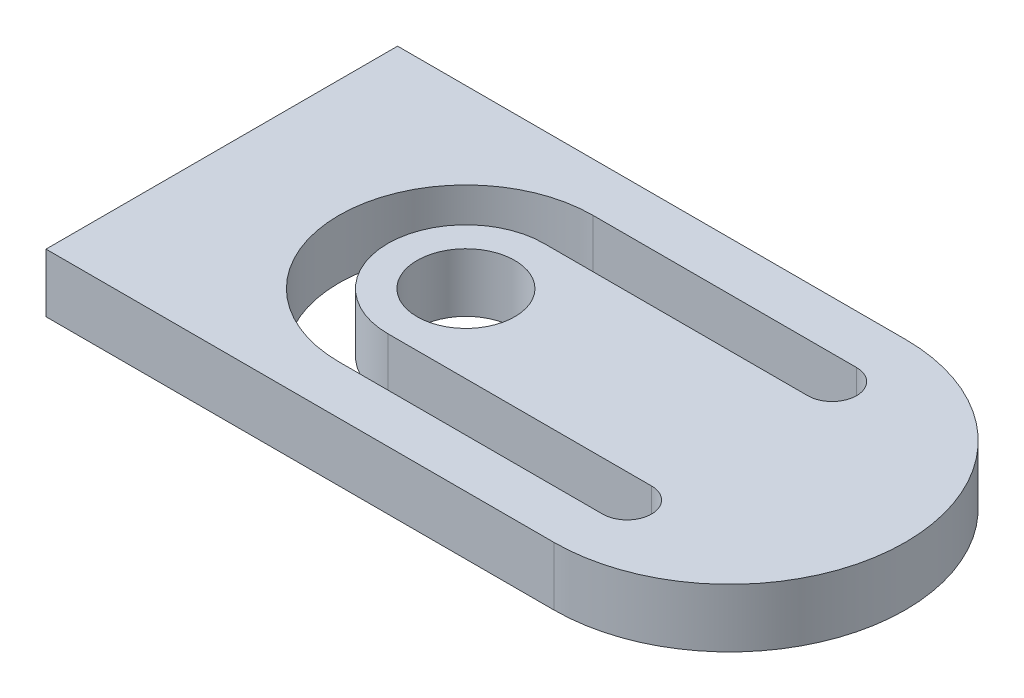
ISO-10303-21;
HEADER;
FILE_DESCRIPTION(('STEP AP214'),'2;1');
FILE_NAME('part.step','',(''),(''),'','','');
FILE_SCHEMA(('AUTOMOTIVE_DESIGN { 1 0 10303 214 1 1 1 1 }'));
ENDSEC;
DATA;
#1=APPLICATION_CONTEXT('core data for automotive mechanical design processes');
#2=APPLICATION_PROTOCOL_DEFINITION('international standard','automotive_design',2000,#1);
#3=PRODUCT_CONTEXT('',#1,'mechanical');
#4=PRODUCT('Part','Part','',(#3));
#5=PRODUCT_RELATED_PRODUCT_CATEGORY('part','',(#4));
#6=PRODUCT_DEFINITION_FORMATION('','',#4);
#7=PRODUCT_DEFINITION_CONTEXT('part definition',#1,'design');
#8=PRODUCT_DEFINITION('design','',#6,#7);
#9=PRODUCT_DEFINITION_SHAPE('','',#8);
#10=(LENGTH_UNIT() NAMED_UNIT(*) SI_UNIT(.MILLI.,.METRE.));
#11=(NAMED_UNIT(*) PLANE_ANGLE_UNIT() SI_UNIT($,.RADIAN.));
#12=(NAMED_UNIT(*) SI_UNIT($,.STERADIAN.) SOLID_ANGLE_UNIT());
#13=UNCERTAINTY_MEASURE_WITH_UNIT(LENGTH_MEASURE(1.E-05),#10,'distance_accuracy_value','');
#14=(GEOMETRIC_REPRESENTATION_CONTEXT(3) GLOBAL_UNCERTAINTY_ASSIGNED_CONTEXT((#13)) GLOBAL_UNIT_ASSIGNED_CONTEXT((#10,
#11,#12)) REPRESENTATION_CONTEXT('',''));
#15=CARTESIAN_POINT('',(0.,0.,0.));
#16=DIRECTION('',(0.,0.,1.));
#17=DIRECTION('',(1.,0.,0.));
#18=AXIS2_PLACEMENT_3D('',#15,#16,#17);
#19=CARTESIAN_POINT('',(6.64397905759164,3.,0.));
#20=DIRECTION('',(0.,-1.,0.));
#21=DIRECTION('',(0.,0.,-1.));
#22=AXIS2_PLACEMENT_3D('',#19,#20,#21);
#23=PLANE('',#22);
#24=CARTESIAN_POINT('',(-6.85602094240837,3.,0.));
#25=DIRECTION('',(0.,1.,0.));
#26=DIRECTION('',(0.,0.,1.));
#27=AXIS2_PLACEMENT_3D('',#24,#25,#26);
#28=CIRCLE('',#27,2.5);
#29=CARTESIAN_POINT('',(-6.85602094240837,3.,2.5));
#30=VERTEX_POINT('',#29);
#31=EDGE_CURVE('E187',#30,#30,#28,.T.);
#32=ORIENTED_EDGE('',*,*,#31,.F.);
#33=EDGE_LOOP('',(#32));
#34=FACE_BOUND('',#33,.T.);
#35=DIRECTION('',(0.,0.,1.));
#36=VECTOR('',#35,1.);
#37=CARTESIAN_POINT('',(-19.3560209424084,3.,-9.));
#38=LINE('',#37,#36);
#39=CARTESIAN_POINT('',(-19.3560209424084,3.,-9.));
#40=VERTEX_POINT('',#39);
#41=CARTESIAN_POINT('',(-19.3560209424084,3.,9.));
#42=VERTEX_POINT('',#41);
#43=EDGE_CURVE('E193',#40,#42,#38,.T.);
#44=ORIENTED_EDGE('',*,*,#43,.T.);
#45=DIRECTION('',(1.,0.,0.));
#46=VECTOR('',#45,1.);
#47=CARTESIAN_POINT('',(-19.3560209424084,3.,9.));
#48=LINE('',#47,#46);
#49=CARTESIAN_POINT('',(6.64397905759164,3.,9.00000000000001));
#50=VERTEX_POINT('',#49);
#51=EDGE_CURVE('E196',#42,#50,#48,.T.);
#52=ORIENTED_EDGE('',*,*,#51,.T.);
#53=CARTESIAN_POINT('',(6.64397905759164,3.,0.));
#54=DIRECTION('',(0.,1.,0.));
#55=DIRECTION('',(0.,0.,-1.));
#56=AXIS2_PLACEMENT_3D('',#53,#54,#55);
#57=CIRCLE('',#56,9.);
#58=CARTESIAN_POINT('',(6.64397905759163,3.,-9.));
#59=VERTEX_POINT('',#58);
#60=EDGE_CURVE('E199',#50,#59,#57,.T.);
#61=ORIENTED_EDGE('',*,*,#60,.T.);
#62=DIRECTION('',(-1.,0.,0.));
#63=VECTOR('',#62,1.);
#64=CARTESIAN_POINT('',(-19.3560209424084,3.,-9.));
#65=LINE('',#64,#63);
#66=EDGE_CURVE('E201',#59,#40,#65,.T.);
#67=ORIENTED_EDGE('',*,*,#66,.T.);
#68=EDGE_LOOP('',(#44,#52,#61,#67));
#69=FACE_BOUND('',#68,.T.);
#70=CARTESIAN_POINT('',(6.64397905759163,3.,-5.25));
#71=DIRECTION('',(0.,1.,0.));
#72=DIRECTION('',(0.,0.,-1.));
#73=AXIS2_PLACEMENT_3D('',#70,#71,#72);
#74=CIRCLE('',#73,1.25);
#75=CARTESIAN_POINT('',(6.64397905759163,3.,-4.));
#76=VERTEX_POINT('',#75);
#77=CARTESIAN_POINT('',(6.64397905759163,3.,-6.5));
#78=VERTEX_POINT('',#77);
#79=EDGE_CURVE('E122',#76,#78,#74,.T.);
#80=ORIENTED_EDGE('',*,*,#79,.F.);
#81=DIRECTION('',(1.,0.,0.));
#82=VECTOR('',#81,1.);
#83=CARTESIAN_POINT('',(-6.85602094240837,3.,-4.));
#84=LINE('',#83,#82);
#85=CARTESIAN_POINT('',(-6.85602094240837,3.,-4.));
#86=VERTEX_POINT('',#85);
#87=EDGE_CURVE('E155',#86,#76,#84,.T.);
#88=ORIENTED_EDGE('',*,*,#87,.F.);
#89=CARTESIAN_POINT('',(-6.85602094240837,3.,0.));
#90=DIRECTION('',(0.,-1.,0.));
#91=DIRECTION('',(0.,0.,1.));
#92=AXIS2_PLACEMENT_3D('',#89,#90,#91);
#93=CIRCLE('',#92,4.);
#94=CARTESIAN_POINT('',(-6.85602094240837,3.,4.));
#95=VERTEX_POINT('',#94);
#96=EDGE_CURVE('E153',#95,#86,#93,.T.);
#97=ORIENTED_EDGE('',*,*,#96,.F.);
#98=DIRECTION('',(-1.,0.,0.));
#99=VECTOR('',#98,1.);
#100=CARTESIAN_POINT('',(-6.85602094240837,3.,4.));
#101=LINE('',#100,#99);
#102=CARTESIAN_POINT('',(6.64397905759164,3.,4.));
#103=VERTEX_POINT('',#102);
#104=EDGE_CURVE('E151',#103,#95,#101,.T.);
#105=ORIENTED_EDGE('',*,*,#104,.F.);
#106=CARTESIAN_POINT('',(6.64397905759164,3.,5.25));
#107=DIRECTION('',(0.,1.,0.));
#108=DIRECTION('',(0.,0.,-1.));
#109=AXIS2_PLACEMENT_3D('',#106,#107,#108);
#110=CIRCLE('',#109,1.25);
#111=CARTESIAN_POINT('',(6.64397905759164,3.,6.5));
#112=VERTEX_POINT('',#111);
#113=EDGE_CURVE('E149',#112,#103,#110,.T.);
#114=ORIENTED_EDGE('',*,*,#113,.F.);
#115=DIRECTION('',(1.,0.,0.));
#116=VECTOR('',#115,1.);
#117=CARTESIAN_POINT('',(-6.85602094240837,3.,6.5));
#118=LINE('',#117,#116);
#119=CARTESIAN_POINT('',(-6.85602094240837,3.,6.5));
#120=VERTEX_POINT('',#119);
#121=EDGE_CURVE('E145',#120,#112,#118,.T.);
#122=ORIENTED_EDGE('',*,*,#121,.F.);
#123=CARTESIAN_POINT('',(-6.85602094240837,3.,0.));
#124=DIRECTION('',(0.,1.,0.));
#125=DIRECTION('',(0.,0.,1.));
#126=AXIS2_PLACEMENT_3D('',#123,#124,#125);
#127=CIRCLE('',#126,6.5);
#128=CARTESIAN_POINT('',(-6.85602094240837,3.,-6.5));
#129=VERTEX_POINT('',#128);
#130=EDGE_CURVE('E143',#129,#120,#127,.T.);
#131=ORIENTED_EDGE('',*,*,#130,.F.);
#132=DIRECTION('',(-1.,0.,0.));
#133=VECTOR('',#132,1.);
#134=CARTESIAN_POINT('',(-6.85602094240837,3.,-6.5));
#135=LINE('',#134,#133);
#136=EDGE_CURVE('E130',#78,#129,#135,.T.);
#137=ORIENTED_EDGE('',*,*,#136,.F.);
#138=EDGE_LOOP('',(#80,#88,#97,#105,#114,#122,#131,#137));
#139=FACE_BOUND('',#138,.T.);
#140=ADVANCED_FACE('F33',(#34,#69,#139),#23,.F.);
#141=CARTESIAN_POINT('',(6.64397905759164,0.,0.));
#142=DIRECTION('',(0.,-1.,0.));
#143=DIRECTION('',(0.,0.,-1.));
#144=AXIS2_PLACEMENT_3D('',#141,#142,#143);
#145=PLANE('',#144);
#146=DIRECTION('',(0.,0.,1.));
#147=VECTOR('',#146,1.);
#148=CARTESIAN_POINT('',(-19.3560209424084,0.,-9.));
#149=LINE('',#148,#147);
#150=CARTESIAN_POINT('',(-19.3560209424084,0.,-9.));
#151=VERTEX_POINT('',#150);
#152=CARTESIAN_POINT('',(-19.3560209424084,0.,9.));
#153=VERTEX_POINT('',#152);
#154=EDGE_CURVE('E190',#151,#153,#149,.T.);
#155=ORIENTED_EDGE('',*,*,#154,.F.);
#156=DIRECTION('',(-1.,0.,0.));
#157=VECTOR('',#156,1.);
#158=CARTESIAN_POINT('',(-19.3560209424084,0.,-9.));
#159=LINE('',#158,#157);
#160=CARTESIAN_POINT('',(6.64397905759163,0.,-9.));
#161=VERTEX_POINT('',#160);
#162=EDGE_CURVE('E197',#161,#151,#159,.T.);
#163=ORIENTED_EDGE('',*,*,#162,.F.);
#164=CARTESIAN_POINT('',(6.64397905759164,0.,0.));
#165=DIRECTION('',(0.,1.,0.));
#166=DIRECTION('',(0.,0.,-1.));
#167=AXIS2_PLACEMENT_3D('',#164,#165,#166);
#168=CIRCLE('',#167,9.);
#169=CARTESIAN_POINT('',(6.64397905759164,0.,9.00000000000001));
#170=VERTEX_POINT('',#169);
#171=EDGE_CURVE('E208',#170,#161,#168,.T.);
#172=ORIENTED_EDGE('',*,*,#171,.F.);
#173=DIRECTION('',(1.,0.,0.));
#174=VECTOR('',#173,1.);
#175=CARTESIAN_POINT('',(-19.3560209424084,0.,9.));
#176=LINE('',#175,#174);
#177=EDGE_CURVE('E206',#153,#170,#176,.T.);
#178=ORIENTED_EDGE('',*,*,#177,.F.);
#179=EDGE_LOOP('',(#155,#163,#172,#178));
#180=FACE_BOUND('',#179,.T.);
#181=CARTESIAN_POINT('',(-6.85602094240837,0.,0.));
#182=DIRECTION('',(0.,1.,0.));
#183=DIRECTION('',(0.,0.,1.));
#184=AXIS2_PLACEMENT_3D('',#181,#182,#183);
#185=CIRCLE('',#184,2.5);
#186=CARTESIAN_POINT('',(-6.85602094240837,0.,2.5));
#187=VERTEX_POINT('',#186);
#188=EDGE_CURVE('E138',#187,#187,#185,.T.);
#189=ORIENTED_EDGE('',*,*,#188,.T.);
#190=EDGE_LOOP('',(#189));
#191=FACE_BOUND('',#190,.T.);
#192=DIRECTION('',(1.,0.,0.));
#193=VECTOR('',#192,1.);
#194=CARTESIAN_POINT('',(-6.85602094240837,0.,-4.));
#195=LINE('',#194,#193);
#196=CARTESIAN_POINT('',(-6.85602094240837,0.,-4.));
#197=VERTEX_POINT('',#196);
#198=CARTESIAN_POINT('',(6.64397905759163,0.,-4.));
#199=VERTEX_POINT('',#198);
#200=EDGE_CURVE('E131',#197,#199,#195,.T.);
#201=ORIENTED_EDGE('',*,*,#200,.T.);
#202=CARTESIAN_POINT('',(6.64397905759163,0.,-5.25));
#203=DIRECTION('',(0.,1.,0.));
#204=DIRECTION('',(0.,0.,-1.));
#205=AXIS2_PLACEMENT_3D('',#202,#203,#204);
#206=CIRCLE('',#205,1.25);
#207=CARTESIAN_POINT('',(6.64397905759163,0.,-6.5));
#208=VERTEX_POINT('',#207);
#209=EDGE_CURVE('E56',#199,#208,#206,.T.);
#210=ORIENTED_EDGE('',*,*,#209,.T.);
#211=DIRECTION('',(-1.,0.,0.));
#212=VECTOR('',#211,1.);
#213=CARTESIAN_POINT('',(-6.85602094240837,0.,-6.5));
#214=LINE('',#213,#212);
#215=CARTESIAN_POINT('',(-6.85602094240837,0.,-6.5));
#216=VERTEX_POINT('',#215);
#217=EDGE_CURVE('E137',#208,#216,#214,.T.);
#218=ORIENTED_EDGE('',*,*,#217,.T.);
#219=CARTESIAN_POINT('',(-6.85602094240837,0.,0.));
#220=DIRECTION('',(0.,1.,0.));
#221=DIRECTION('',(0.,0.,1.));
#222=AXIS2_PLACEMENT_3D('',#219,#220,#221);
#223=CIRCLE('',#222,6.5);
#224=CARTESIAN_POINT('',(-6.85602094240837,0.,6.5));
#225=VERTEX_POINT('',#224);
#226=EDGE_CURVE('E159',#216,#225,#223,.T.);
#227=ORIENTED_EDGE('',*,*,#226,.T.);
#228=DIRECTION('',(1.,0.,0.));
#229=VECTOR('',#228,1.);
#230=CARTESIAN_POINT('',(-6.85602094240837,0.,6.5));
#231=LINE('',#230,#229);
#232=CARTESIAN_POINT('',(6.64397905759164,0.,6.5));
#233=VERTEX_POINT('',#232);
#234=EDGE_CURVE('E162',#225,#233,#231,.T.);
#235=ORIENTED_EDGE('',*,*,#234,.T.);
#236=CARTESIAN_POINT('',(6.64397905759164,0.,5.25));
#237=DIRECTION('',(0.,1.,0.));
#238=DIRECTION('',(0.,0.,-1.));
#239=AXIS2_PLACEMENT_3D('',#236,#237,#238);
#240=CIRCLE('',#239,1.25);
#241=CARTESIAN_POINT('',(6.64397905759164,0.,4.));
#242=VERTEX_POINT('',#241);
#243=EDGE_CURVE('E165',#233,#242,#240,.T.);
#244=ORIENTED_EDGE('',*,*,#243,.T.);
#245=DIRECTION('',(-1.,0.,0.));
#246=VECTOR('',#245,1.);
#247=CARTESIAN_POINT('',(-6.85602094240837,0.,4.));
#248=LINE('',#247,#246);
#249=CARTESIAN_POINT('',(-6.85602094240837,0.,4.));
#250=VERTEX_POINT('',#249);
#251=EDGE_CURVE('E168',#242,#250,#248,.T.);
#252=ORIENTED_EDGE('',*,*,#251,.T.);
#253=CARTESIAN_POINT('',(-6.85602094240837,0.,0.));
#254=DIRECTION('',(0.,-1.,0.));
#255=DIRECTION('',(0.,0.,1.));
#256=AXIS2_PLACEMENT_3D('',#253,#254,#255);
#257=CIRCLE('',#256,4.);
#258=EDGE_CURVE('E171',#250,#197,#257,.T.);
#259=ORIENTED_EDGE('',*,*,#258,.T.);
#260=EDGE_LOOP('',(#201,#210,#218,#227,#235,#244,#252,#259));
#261=FACE_BOUND('',#260,.T.);
#262=ADVANCED_FACE('F226',(#180,#191,#261),#145,.T.);
#263=CARTESIAN_POINT('',(-19.3560209424084,3.,-9.));
#264=DIRECTION('',(1.,0.,0.));
#265=DIRECTION('',(0.,0.,-1.));
#266=AXIS2_PLACEMENT_3D('',#263,#264,#265);
#267=PLANE('',#266);
#268=ORIENTED_EDGE('',*,*,#154,.T.);
#269=DIRECTION('',(0.,-1.,0.));
#270=VECTOR('',#269,1.);
#271=CARTESIAN_POINT('',(-19.3560209424084,3.,9.));
#272=LINE('',#271,#270);
#273=EDGE_CURVE('E11',#42,#153,#272,.T.);
#274=ORIENTED_EDGE('',*,*,#273,.F.);
#275=ORIENTED_EDGE('',*,*,#43,.F.);
#276=DIRECTION('',(0.,-1.,0.));
#277=VECTOR('',#276,1.);
#278=CARTESIAN_POINT('',(-19.3560209424084,3.,-9.));
#279=LINE('',#278,#277);
#280=EDGE_CURVE('E203',#40,#151,#279,.T.);
#281=ORIENTED_EDGE('',*,*,#280,.T.);
#282=EDGE_LOOP('',(#268,#274,#275,#281));
#283=FACE_BOUND('',#282,.T.);
#284=ADVANCED_FACE('F35',(#283),#267,.F.);
#285=CARTESIAN_POINT('',(-19.3560209424084,3.,9.));
#286=DIRECTION('',(0.,0.,-1.));
#287=DIRECTION('',(-1.,0.,0.));
#288=AXIS2_PLACEMENT_3D('',#285,#286,#287);
#289=PLANE('',#288);
#290=ORIENTED_EDGE('',*,*,#177,.T.);
#291=DIRECTION('',(0.,-1.,0.));
#292=VECTOR('',#291,1.);
#293=CARTESIAN_POINT('',(6.64397905759164,3.,9.00000000000001));
#294=LINE('',#293,#292);
#295=EDGE_CURVE('E41',#50,#170,#294,.T.);
#296=ORIENTED_EDGE('',*,*,#295,.F.);
#297=ORIENTED_EDGE('',*,*,#51,.F.);
#298=ORIENTED_EDGE('',*,*,#273,.T.);
#299=EDGE_LOOP('',(#290,#296,#297,#298));
#300=FACE_BOUND('',#299,.T.);
#301=ADVANCED_FACE('F236',(#300),#289,.F.);
#302=CARTESIAN_POINT('',(6.64397905759164,3.,0.));
#303=DIRECTION('',(0.,-1.,0.));
#304=DIRECTION('',(0.,0.,-1.));
#305=AXIS2_PLACEMENT_3D('',#302,#303,#304);
#306=CYLINDRICAL_SURFACE('',#305,9.);
#307=ORIENTED_EDGE('',*,*,#171,.T.);
#308=DIRECTION('',(0.,-1.,0.));
#309=VECTOR('',#308,1.);
#310=CARTESIAN_POINT('',(6.64397905759163,3.,-9.));
#311=LINE('',#310,#309);
#312=EDGE_CURVE('E213',#59,#161,#311,.T.);
#313=ORIENTED_EDGE('',*,*,#312,.F.);
#314=ORIENTED_EDGE('',*,*,#60,.F.);
#315=ORIENTED_EDGE('',*,*,#295,.T.);
#316=EDGE_LOOP('',(#307,#313,#314,#315));
#317=FACE_BOUND('',#316,.T.);
#318=ADVANCED_FACE('F220',(#317),#306,.T.);
#319=CARTESIAN_POINT('',(-19.3560209424084,3.,-9.));
#320=DIRECTION('',(0.,0.,1.));
#321=DIRECTION('',(1.,0.,0.));
#322=AXIS2_PLACEMENT_3D('',#319,#320,#321);
#323=PLANE('',#322);
#324=ORIENTED_EDGE('',*,*,#162,.T.);
#325=ORIENTED_EDGE('',*,*,#280,.F.);
#326=ORIENTED_EDGE('',*,*,#66,.F.);
#327=ORIENTED_EDGE('',*,*,#312,.T.);
#328=EDGE_LOOP('',(#324,#325,#326,#327));
#329=FACE_BOUND('',#328,.T.);
#330=ADVANCED_FACE('F230',(#329),#323,.F.);
#331=CARTESIAN_POINT('',(-6.85602094240837,3.,0.));
#332=DIRECTION('',(0.,-1.,0.));
#333=DIRECTION('',(0.,0.,-1.));
#334=AXIS2_PLACEMENT_3D('',#331,#332,#333);
#335=CYLINDRICAL_SURFACE('',#334,2.5);
#336=ORIENTED_EDGE('',*,*,#31,.T.);
#337=EDGE_LOOP('',(#336));
#338=FACE_BOUND('',#337,.T.);
#339=ORIENTED_EDGE('',*,*,#188,.F.);
#340=EDGE_LOOP('',(#339));
#341=FACE_BOUND('',#340,.T.);
#342=ADVANCED_FACE('F252',(#338,#341),#335,.F.);
#343=CARTESIAN_POINT('',(6.64397905759163,3.,-5.25));
#344=DIRECTION('',(0.,-1.,0.));
#345=DIRECTION('',(0.,0.,-1.));
#346=AXIS2_PLACEMENT_3D('',#343,#344,#345);
#347=CYLINDRICAL_SURFACE('',#346,1.25);
#348=ORIENTED_EDGE('',*,*,#209,.F.);
#349=DIRECTION('',(0.,-1.,0.));
#350=VECTOR('',#349,1.);
#351=CARTESIAN_POINT('',(6.64397905759163,3.,-4.));
#352=LINE('',#351,#350);
#353=EDGE_CURVE('E126',#76,#199,#352,.T.);
#354=ORIENTED_EDGE('',*,*,#353,.F.);
#355=ORIENTED_EDGE('',*,*,#79,.T.);
#356=DIRECTION('',(0.,-1.,0.));
#357=VECTOR('',#356,1.);
#358=CARTESIAN_POINT('',(6.64397905759163,3.,-6.5));
#359=LINE('',#358,#357);
#360=EDGE_CURVE('E125',#78,#208,#359,.T.);
#361=ORIENTED_EDGE('',*,*,#360,.T.);
#362=EDGE_LOOP('',(#348,#354,#355,#361));
#363=FACE_BOUND('',#362,.T.);
#364=ADVANCED_FACE('F124',(#363),#347,.F.);
#365=CARTESIAN_POINT('',(-6.85602094240837,3.,-6.5));
#366=DIRECTION('',(0.,0.,1.));
#367=DIRECTION('',(1.,0.,0.));
#368=AXIS2_PLACEMENT_3D('',#365,#366,#367);
#369=PLANE('',#368);
#370=ORIENTED_EDGE('',*,*,#217,.F.);
#371=ORIENTED_EDGE('',*,*,#360,.F.);
#372=ORIENTED_EDGE('',*,*,#136,.T.);
#373=DIRECTION('',(0.,-1.,0.));
#374=VECTOR('',#373,1.);
#375=CARTESIAN_POINT('',(-6.85602094240837,3.,-6.5));
#376=LINE('',#375,#374);
#377=EDGE_CURVE('E139',#129,#216,#376,.T.);
#378=ORIENTED_EDGE('',*,*,#377,.T.);
#379=EDGE_LOOP('',(#370,#371,#372,#378));
#380=FACE_BOUND('',#379,.T.);
#381=ADVANCED_FACE('F134',(#380),#369,.T.);
#382=CARTESIAN_POINT('',(-6.85602094240837,3.,0.));
#383=DIRECTION('',(0.,-1.,0.));
#384=DIRECTION('',(0.,0.,-1.));
#385=AXIS2_PLACEMENT_3D('',#382,#383,#384);
#386=CYLINDRICAL_SURFACE('',#385,6.5);
#387=ORIENTED_EDGE('',*,*,#226,.F.);
#388=ORIENTED_EDGE('',*,*,#377,.F.);
#389=ORIENTED_EDGE('',*,*,#130,.T.);
#390=DIRECTION('',(0.,-1.,0.));
#391=VECTOR('',#390,1.);
#392=CARTESIAN_POINT('',(-6.85602094240837,3.,6.5));
#393=LINE('',#392,#391);
#394=EDGE_CURVE('E184',#120,#225,#393,.T.);
#395=ORIENTED_EDGE('',*,*,#394,.T.);
#396=EDGE_LOOP('',(#387,#388,#389,#395));
#397=FACE_BOUND('',#396,.T.);
#398=ADVANCED_FACE('F288',(#397),#386,.F.);
#399=CARTESIAN_POINT('',(-6.85602094240837,3.,6.5));
#400=DIRECTION('',(0.,0.,-1.));
#401=DIRECTION('',(-1.,0.,0.));
#402=AXIS2_PLACEMENT_3D('',#399,#400,#401);
#403=PLANE('',#402);
#404=ORIENTED_EDGE('',*,*,#234,.F.);
#405=ORIENTED_EDGE('',*,*,#394,.F.);
#406=ORIENTED_EDGE('',*,*,#121,.T.);
#407=DIRECTION('',(0.,-1.,0.));
#408=VECTOR('',#407,1.);
#409=CARTESIAN_POINT('',(6.64397905759164,3.,6.5));
#410=LINE('',#409,#408);
#411=EDGE_CURVE('E182',#112,#233,#410,.T.);
#412=ORIENTED_EDGE('',*,*,#411,.T.);
#413=EDGE_LOOP('',(#404,#405,#406,#412));
#414=FACE_BOUND('',#413,.T.);
#415=ADVANCED_FACE('F285',(#414),#403,.T.);
#416=CARTESIAN_POINT('',(6.64397905759164,3.,5.25));
#417=DIRECTION('',(0.,-1.,0.));
#418=DIRECTION('',(0.,0.,-1.));
#419=AXIS2_PLACEMENT_3D('',#416,#417,#418);
#420=CYLINDRICAL_SURFACE('',#419,1.25);
#421=ORIENTED_EDGE('',*,*,#243,.F.);
#422=ORIENTED_EDGE('',*,*,#411,.F.);
#423=ORIENTED_EDGE('',*,*,#113,.T.);
#424=DIRECTION('',(0.,-1.,0.));
#425=VECTOR('',#424,1.);
#426=CARTESIAN_POINT('',(6.64397905759164,3.,4.));
#427=LINE('',#426,#425);
#428=EDGE_CURVE('E180',#103,#242,#427,.T.);
#429=ORIENTED_EDGE('',*,*,#428,.T.);
#430=EDGE_LOOP('',(#421,#422,#423,#429));
#431=FACE_BOUND('',#430,.T.);
#432=ADVANCED_FACE('F280',(#431),#420,.F.);
#433=CARTESIAN_POINT('',(-6.85602094240837,3.,4.));
#434=DIRECTION('',(0.,0.,1.));
#435=DIRECTION('',(1.,0.,0.));
#436=AXIS2_PLACEMENT_3D('',#433,#434,#435);
#437=PLANE('',#436);
#438=ORIENTED_EDGE('',*,*,#251,.F.);
#439=ORIENTED_EDGE('',*,*,#428,.F.);
#440=ORIENTED_EDGE('',*,*,#104,.T.);
#441=DIRECTION('',(0.,-1.,0.));
#442=VECTOR('',#441,1.);
#443=CARTESIAN_POINT('',(-6.85602094240837,3.,4.));
#444=LINE('',#443,#442);
#445=EDGE_CURVE('E178',#95,#250,#444,.T.);
#446=ORIENTED_EDGE('',*,*,#445,.T.);
#447=EDGE_LOOP('',(#438,#439,#440,#446));
#448=FACE_BOUND('',#447,.T.);
#449=ADVANCED_FACE('F276',(#448),#437,.T.);
#450=CARTESIAN_POINT('',(-6.85602094240837,3.,0.));
#451=DIRECTION('',(0.,-1.,0.));
#452=DIRECTION('',(0.,0.,-1.));
#453=AXIS2_PLACEMENT_3D('',#450,#451,#452);
#454=CYLINDRICAL_SURFACE('',#453,4.);
#455=ORIENTED_EDGE('',*,*,#258,.F.);
#456=ORIENTED_EDGE('',*,*,#445,.F.);
#457=ORIENTED_EDGE('',*,*,#96,.T.);
#458=DIRECTION('',(0.,-1.,0.));
#459=VECTOR('',#458,1.);
#460=CARTESIAN_POINT('',(-6.85602094240837,3.,-4.));
#461=LINE('',#460,#459);
#462=EDGE_CURVE('E48',#86,#197,#461,.T.);
#463=ORIENTED_EDGE('',*,*,#462,.T.);
#464=EDGE_LOOP('',(#455,#456,#457,#463));
#465=FACE_BOUND('',#464,.T.);
#466=ADVANCED_FACE('F273',(#465),#454,.T.);
#467=CARTESIAN_POINT('',(-6.85602094240837,3.,-4.));
#468=DIRECTION('',(0.,0.,-1.));
#469=DIRECTION('',(-1.,0.,0.));
#470=AXIS2_PLACEMENT_3D('',#467,#468,#469);
#471=PLANE('',#470);
#472=ORIENTED_EDGE('',*,*,#200,.F.);
#473=ORIENTED_EDGE('',*,*,#462,.F.);
#474=ORIENTED_EDGE('',*,*,#87,.T.);
#475=ORIENTED_EDGE('',*,*,#353,.T.);
#476=EDGE_LOOP('',(#472,#473,#474,#475));
#477=FACE_BOUND('',#476,.T.);
#478=ADVANCED_FACE('F267',(#477),#471,.T.);
#479=CLOSED_SHELL('',(#140,#262,#284,#301,#318,#330,#342,#364,#381,#398,#415,#432,#449,#466,#478));
#480=MANIFOLD_SOLID_BREP('B2',#479);
#481=ADVANCED_BREP_SHAPE_REPRESENTATION('',(#18,#480),#14);
#482=SHAPE_DEFINITION_REPRESENTATION(#9,#481);
ENDSEC;
END-ISO-10303-21;
